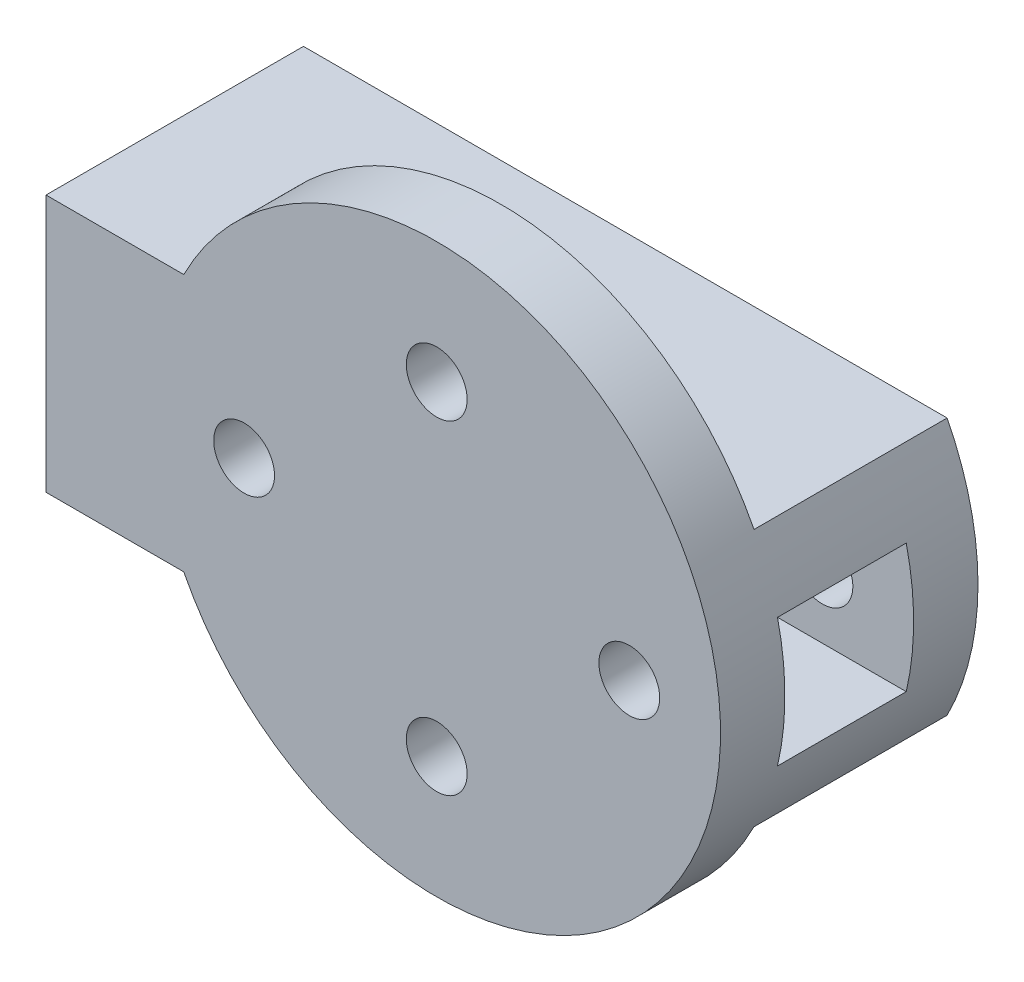
ISO-10303-21;
HEADER;
FILE_DESCRIPTION(('STEP AP214'),'2;1');
FILE_NAME('part.step','',(''),(''),'','','');
FILE_SCHEMA(('AUTOMOTIVE_DESIGN { 1 0 10303 214 1 1 1 1 }'));
ENDSEC;
DATA;
#1=APPLICATION_CONTEXT('core data for automotive mechanical design processes');
#2=APPLICATION_PROTOCOL_DEFINITION('international standard','automotive_design',2000,#1);
#3=PRODUCT_CONTEXT('',#1,'mechanical');
#4=PRODUCT('Part','Part','',(#3));
#5=PRODUCT_RELATED_PRODUCT_CATEGORY('part','',(#4));
#6=PRODUCT_DEFINITION_FORMATION('','',#4);
#7=PRODUCT_DEFINITION_CONTEXT('part definition',#1,'design');
#8=PRODUCT_DEFINITION('design','',#6,#7);
#9=PRODUCT_DEFINITION_SHAPE('','',#8);
#10=(LENGTH_UNIT() NAMED_UNIT(*) SI_UNIT(.MILLI.,.METRE.));
#11=(NAMED_UNIT(*) PLANE_ANGLE_UNIT() SI_UNIT($,.RADIAN.));
#12=(NAMED_UNIT(*) SI_UNIT($,.STERADIAN.) SOLID_ANGLE_UNIT());
#13=UNCERTAINTY_MEASURE_WITH_UNIT(LENGTH_MEASURE(1.E-05),#10,'distance_accuracy_value','');
#14=(GEOMETRIC_REPRESENTATION_CONTEXT(3) GLOBAL_UNCERTAINTY_ASSIGNED_CONTEXT((#13)) GLOBAL_UNIT_ASSIGNED_CONTEXT((#10,
#11,#12)) REPRESENTATION_CONTEXT('',''));
#15=CARTESIAN_POINT('',(0.,0.,0.));
#16=DIRECTION('',(0.,0.,1.));
#17=DIRECTION('',(1.,0.,0.));
#18=AXIS2_PLACEMENT_3D('',#15,#16,#17);
#19=CARTESIAN_POINT('',(0.,0.,3.175));
#20=DIRECTION('',(0.,0.,-1.));
#21=DIRECTION('',(-1.,0.,0.));
#22=AXIS2_PLACEMENT_3D('',#19,#20,#21);
#23=CYLINDRICAL_SURFACE('',#22,14.);
#24=DIRECTION('',(0.,0.,-1.));
#25=VECTOR('',#24,1.);
#26=CARTESIAN_POINT('',(13.6352255206872,3.175,3.175));
#27=LINE('',#26,#25);
#28=CARTESIAN_POINT('',(13.6352255206872,3.175,0.));
#29=VERTEX_POINT('',#28);
#30=CARTESIAN_POINT('',(13.6352255206872,3.175,-6.35));
#31=VERTEX_POINT('',#30);
#32=EDGE_CURVE('E137',#29,#31,#27,.T.);
#33=ORIENTED_EDGE('',*,*,#32,.T.);
#34=CARTESIAN_POINT('',(0.,0.,-6.35));
#35=DIRECTION('',(0.,0.,-1.));
#36=DIRECTION('',(-1.,0.,0.));
#37=AXIS2_PLACEMENT_3D('',#34,#35,#36);
#38=CIRCLE('',#37,14.);
#39=CARTESIAN_POINT('',(13.6352255206872,-3.175,-6.35));
#40=VERTEX_POINT('',#39);
#41=EDGE_CURVE('E117',#31,#40,#38,.T.);
#42=ORIENTED_EDGE('',*,*,#41,.T.);
#43=DIRECTION('',(0.,0.,-1.));
#44=VECTOR('',#43,1.);
#45=CARTESIAN_POINT('',(13.6352255206872,-3.175,3.175));
#46=LINE('',#45,#44);
#47=CARTESIAN_POINT('',(13.6352255206872,-3.175,0.));
#48=VERTEX_POINT('',#47);
#49=EDGE_CURVE('E142',#40,#48,#46,.F.);
#50=ORIENTED_EDGE('',*,*,#49,.T.);
#51=CARTESIAN_POINT('',(0.,0.,0.));
#52=DIRECTION('',(0.,0.,1.));
#53=DIRECTION('',(1.,0.,0.));
#54=AXIS2_PLACEMENT_3D('',#51,#52,#53);
#55=CIRCLE('',#54,14.);
#56=EDGE_CURVE('E145',#48,#29,#55,.T.);
#57=ORIENTED_EDGE('',*,*,#56,.T.);
#58=EDGE_LOOP('',(#33,#42,#50,#57));
#59=FACE_BOUND('',#58,.T.);
#60=DIRECTION('',(0.,0.,-1.));
#61=VECTOR('',#60,1.);
#62=CARTESIAN_POINT('',(-12.477078985083,6.35,3.175));
#63=LINE('',#62,#61);
#64=CARTESIAN_POINT('',(-12.477078985083,6.35,3.175));
#65=VERTEX_POINT('',#64);
#66=CARTESIAN_POINT('',(-12.477078985083,6.35,0.));
#67=VERTEX_POINT('',#66);
#68=EDGE_CURVE('E175',#65,#67,#63,.T.);
#69=ORIENTED_EDGE('',*,*,#68,.F.);
#70=CARTESIAN_POINT('',(0.,0.,3.175));
#71=DIRECTION('',(0.,0.,1.));
#72=DIRECTION('',(1.,0.,0.));
#73=AXIS2_PLACEMENT_3D('',#70,#71,#72);
#74=CIRCLE('',#73,14.);
#75=CARTESIAN_POINT('',(-12.477078985083,-6.35,3.175));
#76=VERTEX_POINT('',#75);
#77=EDGE_CURVE('E182',#76,#65,#74,.T.);
#78=ORIENTED_EDGE('',*,*,#77,.F.);
#79=DIRECTION('',(0.,0.,-1.));
#80=VECTOR('',#79,1.);
#81=CARTESIAN_POINT('',(-12.477078985083,-6.35,3.175));
#82=LINE('',#81,#80);
#83=CARTESIAN_POINT('',(-12.477078985083,-6.35,0.));
#84=VERTEX_POINT('',#83);
#85=EDGE_CURVE('E178',#84,#76,#82,.F.);
#86=ORIENTED_EDGE('',*,*,#85,.F.);
#87=CARTESIAN_POINT('',(0.,0.,0.));
#88=DIRECTION('',(0.,0.,1.));
#89=DIRECTION('',(1.,0.,0.));
#90=AXIS2_PLACEMENT_3D('',#87,#88,#89);
#91=CIRCLE('',#90,14.);
#92=CARTESIAN_POINT('',(12.477078985083,-6.35,0.));
#93=VERTEX_POINT('',#92);
#94=EDGE_CURVE('E181',#84,#93,#91,.T.);
#95=ORIENTED_EDGE('',*,*,#94,.T.);
#96=DIRECTION('',(0.,0.,1.));
#97=VECTOR('',#96,1.);
#98=CARTESIAN_POINT('',(12.477078985083,-6.35,-9.525));
#99=LINE('',#98,#97);
#100=CARTESIAN_POINT('',(12.477078985083,-6.35,-9.525));
#101=VERTEX_POINT('',#100);
#102=EDGE_CURVE('E172',#101,#93,#99,.T.);
#103=ORIENTED_EDGE('',*,*,#102,.F.);
#104=CARTESIAN_POINT('',(0.,0.,-9.525));
#105=DIRECTION('',(0.,0.,-1.));
#106=DIRECTION('',(-1.,0.,0.));
#107=AXIS2_PLACEMENT_3D('',#104,#105,#106);
#108=CIRCLE('',#107,14.);
#109=CARTESIAN_POINT('',(12.477078985083,6.35,-9.525));
#110=VERTEX_POINT('',#109);
#111=EDGE_CURVE('E148',#110,#101,#108,.T.);
#112=ORIENTED_EDGE('',*,*,#111,.F.);
#113=DIRECTION('',(0.,0.,1.));
#114=VECTOR('',#113,1.);
#115=CARTESIAN_POINT('',(12.477078985083,6.35,-9.525));
#116=LINE('',#115,#114);
#117=CARTESIAN_POINT('',(12.477078985083,6.35,0.));
#118=VERTEX_POINT('',#117);
#119=EDGE_CURVE('E158',#110,#118,#116,.T.);
#120=ORIENTED_EDGE('',*,*,#119,.T.);
#121=EDGE_CURVE('E185',#118,#67,#91,.T.);
#122=ORIENTED_EDGE('',*,*,#121,.T.);
#123=EDGE_LOOP('',(#69,#78,#86,#95,#103,#112,#120,#122));
#124=FACE_BOUND('',#123,.T.);
#125=ADVANCED_FACE('F33',(#59,#124),#23,.T.);
#126=CARTESIAN_POINT('',(0.,0.,0.));
#127=DIRECTION('',(0.,0.,1.));
#128=DIRECTION('',(1.,0.,0.));
#129=AXIS2_PLACEMENT_3D('',#126,#127,#128);
#130=PLANE('',#129);
#131=CARTESIAN_POINT('',(0.,-8.,0.));
#132=DIRECTION('',(0.,0.,1.));
#133=DIRECTION('',(1.,0.,0.));
#134=AXIS2_PLACEMENT_3D('',#131,#132,#133);
#135=CIRCLE('',#134,1.5);
#136=CARTESIAN_POINT('',(1.5,-8.,0.));
#137=VERTEX_POINT('',#136);
#138=EDGE_CURVE('E220',#137,#137,#135,.T.);
#139=ORIENTED_EDGE('',*,*,#138,.T.);
#140=EDGE_LOOP('',(#139));
#141=FACE_BOUND('',#140,.T.);
#142=DIRECTION('',(-1.,0.,0.));
#143=VECTOR('',#142,1.);
#144=CARTESIAN_POINT('',(0.,-6.35,0.));
#145=LINE('',#144,#143);
#146=EDGE_CURVE('E11',#93,#84,#145,.T.);
#147=ORIENTED_EDGE('',*,*,#146,.F.);
#148=ORIENTED_EDGE('',*,*,#94,.F.);
#149=EDGE_LOOP('',(#147,#148));
#150=FACE_BOUND('',#149,.T.);
#151=ADVANCED_FACE('F258',(#141,#150),#130,.F.);
#152=CARTESIAN_POINT('',(0.,8.,0.));
#153=DIRECTION('',(0.,0.,1.));
#154=DIRECTION('',(1.,0.,0.));
#155=AXIS2_PLACEMENT_3D('',#152,#153,#154);
#156=CIRCLE('',#155,1.5);
#157=CARTESIAN_POINT('',(1.5,8.,0.));
#158=VERTEX_POINT('',#157);
#159=EDGE_CURVE('E212',#158,#158,#156,.T.);
#160=ORIENTED_EDGE('',*,*,#159,.T.);
#161=EDGE_LOOP('',(#160));
#162=FACE_BOUND('',#161,.T.);
#163=DIRECTION('',(1.,0.,0.));
#164=VECTOR('',#163,1.);
#165=CARTESIAN_POINT('',(0.,6.35,0.));
#166=LINE('',#165,#164);
#167=EDGE_CURVE('E41',#67,#118,#166,.T.);
#168=ORIENTED_EDGE('',*,*,#167,.F.);
#169=ORIENTED_EDGE('',*,*,#121,.F.);
#170=EDGE_LOOP('',(#168,#169));
#171=FACE_BOUND('',#170,.T.);
#172=ADVANCED_FACE('F234',(#162,#171),#130,.F.);
#173=CARTESIAN_POINT('',(0.,0.,3.175));
#174=DIRECTION('',(0.,0.,1.));
#175=DIRECTION('',(1.,0.,0.));
#176=AXIS2_PLACEMENT_3D('',#173,#174,#175);
#177=PLANE('',#176);
#178=CARTESIAN_POINT('',(0.,-8.,3.175));
#179=DIRECTION('',(0.,0.,1.));
#180=DIRECTION('',(-1.,0.,0.));
#181=AXIS2_PLACEMENT_3D('',#178,#179,#180);
#182=CIRCLE('',#181,1.5);
#183=CARTESIAN_POINT('',(-1.5,-8.,3.175));
#184=VERTEX_POINT('',#183);
#185=EDGE_CURVE('E223',#184,#184,#182,.T.);
#186=ORIENTED_EDGE('',*,*,#185,.F.);
#187=EDGE_LOOP('',(#186));
#188=FACE_BOUND('',#187,.T.);
#189=CARTESIAN_POINT('',(0.,8.,3.175));
#190=DIRECTION('',(0.,0.,1.));
#191=DIRECTION('',(1.,0.,0.));
#192=AXIS2_PLACEMENT_3D('',#189,#190,#191);
#193=CIRCLE('',#192,1.5);
#194=CARTESIAN_POINT('',(1.5,8.,3.175));
#195=VERTEX_POINT('',#194);
#196=EDGE_CURVE('E217',#195,#195,#193,.T.);
#197=ORIENTED_EDGE('',*,*,#196,.F.);
#198=EDGE_LOOP('',(#197));
#199=FACE_BOUND('',#198,.T.);
#200=CARTESIAN_POINT('',(9.5,0.,3.175));
#201=DIRECTION('',(0.,0.,1.));
#202=DIRECTION('',(-1.,0.,0.));
#203=AXIS2_PLACEMENT_3D('',#200,#201,#202);
#204=CIRCLE('',#203,1.5);
#205=CARTESIAN_POINT('',(8.,0.,3.175));
#206=VERTEX_POINT('',#205);
#207=EDGE_CURVE('E208',#206,#206,#204,.T.);
#208=ORIENTED_EDGE('',*,*,#207,.F.);
#209=EDGE_LOOP('',(#208));
#210=FACE_BOUND('',#209,.T.);
#211=CARTESIAN_POINT('',(-9.5,0.,3.175));
#212=DIRECTION('',(0.,0.,1.));
#213=DIRECTION('',(1.,0.,0.));
#214=AXIS2_PLACEMENT_3D('',#211,#212,#213);
#215=CIRCLE('',#214,1.5);
#216=CARTESIAN_POINT('',(-8.,0.,3.175));
#217=VERTEX_POINT('',#216);
#218=EDGE_CURVE('E198',#217,#217,#215,.T.);
#219=ORIENTED_EDGE('',*,*,#218,.F.);
#220=EDGE_LOOP('',(#219));
#221=FACE_BOUND('',#220,.T.);
#222=ORIENTED_EDGE('',*,*,#77,.T.);
#223=DIRECTION('',(1.,0.,0.));
#224=VECTOR('',#223,1.);
#225=CARTESIAN_POINT('',(12.477078985083,6.35,3.175));
#226=LINE('',#225,#224);
#227=CARTESIAN_POINT('',(-19.272921014917,6.35,3.175));
#228=VERTEX_POINT('',#227);
#229=EDGE_CURVE('E152',#228,#65,#226,.T.);
#230=ORIENTED_EDGE('',*,*,#229,.F.);
#231=DIRECTION('',(0.,1.,0.));
#232=VECTOR('',#231,1.);
#233=CARTESIAN_POINT('',(-19.272921014917,6.35,3.175));
#234=LINE('',#233,#232);
#235=CARTESIAN_POINT('',(-19.272921014917,-6.35,3.175));
#236=VERTEX_POINT('',#235);
#237=EDGE_CURVE('E160',#236,#228,#234,.T.);
#238=ORIENTED_EDGE('',*,*,#237,.F.);
#239=DIRECTION('',(-1.,0.,0.));
#240=VECTOR('',#239,1.);
#241=CARTESIAN_POINT('',(12.477078985083,-6.35,3.175));
#242=LINE('',#241,#240);
#243=EDGE_CURVE('E147',#76,#236,#242,.T.);
#244=ORIENTED_EDGE('',*,*,#243,.F.);
#245=EDGE_LOOP('',(#222,#230,#238,#244));
#246=FACE_BOUND('',#245,.T.);
#247=ADVANCED_FACE('F230',(#188,#199,#210,#221,#246),#177,.T.);
#248=CARTESIAN_POINT('',(12.477078985083,-6.35,-9.525));
#249=DIRECTION('',(0.,1.,0.));
#250=DIRECTION('',(0.,0.,1.));
#251=AXIS2_PLACEMENT_3D('',#248,#249,#250);
#252=PLANE('',#251);
#253=ORIENTED_EDGE('',*,*,#146,.T.);
#254=ORIENTED_EDGE('',*,*,#85,.T.);
#255=ORIENTED_EDGE('',*,*,#243,.T.);
#256=DIRECTION('',(0.,0.,1.));
#257=VECTOR('',#256,1.);
#258=CARTESIAN_POINT('',(-19.272921014917,-6.35,-9.525));
#259=LINE('',#258,#257);
#260=CARTESIAN_POINT('',(-19.272921014917,-6.35,-9.525));
#261=VERTEX_POINT('',#260);
#262=EDGE_CURVE('E169',#261,#236,#259,.T.);
#263=ORIENTED_EDGE('',*,*,#262,.F.);
#264=DIRECTION('',(-1.,0.,0.));
#265=VECTOR('',#264,1.);
#266=CARTESIAN_POINT('',(12.477078985083,-6.35,-9.525));
#267=LINE('',#266,#265);
#268=EDGE_CURVE('E151',#101,#261,#267,.T.);
#269=ORIENTED_EDGE('',*,*,#268,.F.);
#270=ORIENTED_EDGE('',*,*,#102,.T.);
#271=EDGE_LOOP('',(#253,#254,#255,#263,#269,#270));
#272=FACE_BOUND('',#271,.T.);
#273=ADVANCED_FACE('F233',(#272),#252,.F.);
#274=CARTESIAN_POINT('',(12.477078985083,6.35,-9.525));
#275=DIRECTION('',(0.,-1.,0.));
#276=DIRECTION('',(0.,0.,-1.));
#277=AXIS2_PLACEMENT_3D('',#274,#275,#276);
#278=PLANE('',#277);
#279=ORIENTED_EDGE('',*,*,#229,.T.);
#280=ORIENTED_EDGE('',*,*,#68,.T.);
#281=ORIENTED_EDGE('',*,*,#167,.T.);
#282=ORIENTED_EDGE('',*,*,#119,.F.);
#283=DIRECTION('',(1.,0.,0.));
#284=VECTOR('',#283,1.);
#285=CARTESIAN_POINT('',(12.477078985083,6.35,-9.525));
#286=LINE('',#285,#284);
#287=CARTESIAN_POINT('',(-19.272921014917,6.35,-9.525));
#288=VERTEX_POINT('',#287);
#289=EDGE_CURVE('E156',#288,#110,#286,.T.);
#290=ORIENTED_EDGE('',*,*,#289,.F.);
#291=DIRECTION('',(0.,0.,1.));
#292=VECTOR('',#291,1.);
#293=CARTESIAN_POINT('',(-19.272921014917,6.35,-9.525));
#294=LINE('',#293,#292);
#295=EDGE_CURVE('E166',#288,#228,#294,.T.);
#296=ORIENTED_EDGE('',*,*,#295,.T.);
#297=EDGE_LOOP('',(#279,#280,#281,#282,#290,#296));
#298=FACE_BOUND('',#297,.T.);
#299=ADVANCED_FACE('F247',(#298),#278,.F.);
#300=CARTESIAN_POINT('',(-19.272921014917,6.35,-9.525));
#301=DIRECTION('',(1.,0.,0.));
#302=DIRECTION('',(0.,0.,-1.));
#303=AXIS2_PLACEMENT_3D('',#300,#301,#302);
#304=PLANE('',#303);
#305=DIRECTION('',(0.,0.,-1.));
#306=VECTOR('',#305,1.);
#307=CARTESIAN_POINT('',(-19.272921014917,3.175,-6.35));
#308=LINE('',#307,#306);
#309=CARTESIAN_POINT('',(-19.272921014917,3.175,0.));
#310=VERTEX_POINT('',#309);
#311=CARTESIAN_POINT('',(-19.272921014917,3.175,-6.35));
#312=VERTEX_POINT('',#311);
#313=EDGE_CURVE('E123',#310,#312,#308,.T.);
#314=ORIENTED_EDGE('',*,*,#313,.F.);
#315=DIRECTION('',(0.,1.,0.));
#316=VECTOR('',#315,1.);
#317=CARTESIAN_POINT('',(-19.272921014917,-3.175,0.));
#318=LINE('',#317,#316);
#319=CARTESIAN_POINT('',(-19.272921014917,-3.175,0.));
#320=VERTEX_POINT('',#319);
#321=EDGE_CURVE('E57',#320,#310,#318,.T.);
#322=ORIENTED_EDGE('',*,*,#321,.F.);
#323=DIRECTION('',(0.,0.,1.));
#324=VECTOR('',#323,1.);
#325=CARTESIAN_POINT('',(-19.272921014917,-3.175,-6.35));
#326=LINE('',#325,#324);
#327=CARTESIAN_POINT('',(-19.272921014917,-3.175,-6.35));
#328=VERTEX_POINT('',#327);
#329=EDGE_CURVE('E130',#328,#320,#326,.T.);
#330=ORIENTED_EDGE('',*,*,#329,.F.);
#331=DIRECTION('',(0.,-1.,0.));
#332=VECTOR('',#331,1.);
#333=CARTESIAN_POINT('',(-19.272921014917,-3.175,-6.35));
#334=LINE('',#333,#332);
#335=EDGE_CURVE('E115',#312,#328,#334,.T.);
#336=ORIENTED_EDGE('',*,*,#335,.F.);
#337=EDGE_LOOP('',(#314,#322,#330,#336));
#338=FACE_BOUND('',#337,.T.);
#339=ORIENTED_EDGE('',*,*,#237,.T.);
#340=ORIENTED_EDGE('',*,*,#295,.F.);
#341=DIRECTION('',(0.,1.,0.));
#342=VECTOR('',#341,1.);
#343=CARTESIAN_POINT('',(-19.272921014917,6.35,-9.525));
#344=LINE('',#343,#342);
#345=EDGE_CURVE('E154',#261,#288,#344,.T.);
#346=ORIENTED_EDGE('',*,*,#345,.F.);
#347=ORIENTED_EDGE('',*,*,#262,.T.);
#348=EDGE_LOOP('',(#339,#340,#346,#347));
#349=FACE_BOUND('',#348,.T.);
#350=ADVANCED_FACE('F127',(#338,#349),#304,.F.);
#351=CARTESIAN_POINT('',(0.,0.,-9.525));
#352=DIRECTION('',(0.,0.,-1.));
#353=DIRECTION('',(-1.,0.,0.));
#354=AXIS2_PLACEMENT_3D('',#351,#352,#353);
#355=PLANE('',#354);
#356=CARTESIAN_POINT('',(9.5,0.,-9.525));
#357=DIRECTION('',(0.,0.,1.));
#358=DIRECTION('',(-1.,0.,0.));
#359=AXIS2_PLACEMENT_3D('',#356,#357,#358);
#360=CIRCLE('',#359,1.5);
#361=CARTESIAN_POINT('',(8.,0.,-9.525));
#362=VERTEX_POINT('',#361);
#363=EDGE_CURVE('E211',#362,#362,#360,.T.);
#364=ORIENTED_EDGE('',*,*,#363,.T.);
#365=EDGE_LOOP('',(#364));
#366=FACE_BOUND('',#365,.T.);
#367=CARTESIAN_POINT('',(-9.5,0.,-9.525));
#368=DIRECTION('',(0.,0.,1.));
#369=DIRECTION('',(1.,0.,0.));
#370=AXIS2_PLACEMENT_3D('',#367,#368,#369);
#371=CIRCLE('',#370,1.5);
#372=CARTESIAN_POINT('',(-8.,0.,-9.525));
#373=VERTEX_POINT('',#372);
#374=EDGE_CURVE('E192',#373,#373,#371,.T.);
#375=ORIENTED_EDGE('',*,*,#374,.T.);
#376=EDGE_LOOP('',(#375));
#377=FACE_BOUND('',#376,.T.);
#378=ORIENTED_EDGE('',*,*,#111,.T.);
#379=ORIENTED_EDGE('',*,*,#268,.T.);
#380=ORIENTED_EDGE('',*,*,#345,.T.);
#381=ORIENTED_EDGE('',*,*,#289,.T.);
#382=EDGE_LOOP('',(#378,#379,#380,#381));
#383=FACE_BOUND('',#382,.T.);
#384=ADVANCED_FACE('F272',(#366,#377,#383),#355,.T.);
#385=CARTESIAN_POINT('',(14.,-3.175,0.));
#386=DIRECTION('',(0.,0.,1.));
#387=DIRECTION('',(1.,0.,0.));
#388=AXIS2_PLACEMENT_3D('',#385,#386,#387);
#389=PLANE('',#388);
#390=CARTESIAN_POINT('',(9.5,0.,0.));
#391=DIRECTION('',(0.,0.,1.));
#392=DIRECTION('',(1.,0.,0.));
#393=AXIS2_PLACEMENT_3D('',#390,#391,#392);
#394=CIRCLE('',#393,1.5);
#395=CARTESIAN_POINT('',(11.,0.,0.));
#396=VERTEX_POINT('',#395);
#397=EDGE_CURVE('E203',#396,#396,#394,.T.);
#398=ORIENTED_EDGE('',*,*,#397,.T.);
#399=EDGE_LOOP('',(#398));
#400=FACE_BOUND('',#399,.T.);
#401=CARTESIAN_POINT('',(-9.5,0.,0.));
#402=DIRECTION('',(0.,0.,1.));
#403=DIRECTION('',(1.,0.,0.));
#404=AXIS2_PLACEMENT_3D('',#401,#402,#403);
#405=CIRCLE('',#404,1.5);
#406=CARTESIAN_POINT('',(-8.,0.,0.));
#407=VERTEX_POINT('',#406);
#408=EDGE_CURVE('E191',#407,#407,#405,.T.);
#409=ORIENTED_EDGE('',*,*,#408,.T.);
#410=EDGE_LOOP('',(#409));
#411=FACE_BOUND('',#410,.T.);
#412=ORIENTED_EDGE('',*,*,#56,.F.);
#413=DIRECTION('',(-1.,0.,0.));
#414=VECTOR('',#413,1.);
#415=CARTESIAN_POINT('',(14.,-3.175,0.));
#416=LINE('',#415,#414);
#417=EDGE_CURVE('E135',#48,#320,#416,.T.);
#418=ORIENTED_EDGE('',*,*,#417,.T.);
#419=ORIENTED_EDGE('',*,*,#321,.T.);
#420=DIRECTION('',(-1.,0.,0.));
#421=VECTOR('',#420,1.);
#422=CARTESIAN_POINT('',(14.,3.175,0.));
#423=LINE('',#422,#421);
#424=EDGE_CURVE('E120',#29,#310,#423,.T.);
#425=ORIENTED_EDGE('',*,*,#424,.F.);
#426=EDGE_LOOP('',(#412,#418,#419,#425));
#427=FACE_BOUND('',#426,.T.);
#428=ADVANCED_FACE('F277',(#400,#411,#427),#389,.F.);
#429=CARTESIAN_POINT('',(14.,-3.175,-6.35));
#430=DIRECTION('',(0.,-1.,0.));
#431=DIRECTION('',(0.,0.,-1.));
#432=AXIS2_PLACEMENT_3D('',#429,#430,#431);
#433=PLANE('',#432);
#434=DIRECTION('',(-1.,0.,0.));
#435=VECTOR('',#434,1.);
#436=CARTESIAN_POINT('',(14.,-3.175,-6.35));
#437=LINE('',#436,#435);
#438=EDGE_CURVE('E119',#40,#328,#437,.T.);
#439=ORIENTED_EDGE('',*,*,#438,.T.);
#440=ORIENTED_EDGE('',*,*,#329,.T.);
#441=ORIENTED_EDGE('',*,*,#417,.F.);
#442=ORIENTED_EDGE('',*,*,#49,.F.);
#443=EDGE_LOOP('',(#439,#440,#441,#442));
#444=FACE_BOUND('',#443,.T.);
#445=ADVANCED_FACE('F281',(#444),#433,.F.);
#446=CARTESIAN_POINT('',(14.,-3.175,-6.35));
#447=DIRECTION('',(0.,0.,-1.));
#448=DIRECTION('',(-1.,0.,0.));
#449=AXIS2_PLACEMENT_3D('',#446,#447,#448);
#450=PLANE('',#449);
#451=CARTESIAN_POINT('',(9.5,0.,-6.35));
#452=DIRECTION('',(0.,0.,-1.));
#453=DIRECTION('',(-1.,0.,0.));
#454=AXIS2_PLACEMENT_3D('',#451,#452,#453);
#455=CIRCLE('',#454,1.5);
#456=CARTESIAN_POINT('',(8.,0.,-6.35));
#457=VERTEX_POINT('',#456);
#458=EDGE_CURVE('E36',#457,#457,#455,.T.);
#459=ORIENTED_EDGE('',*,*,#458,.T.);
#460=EDGE_LOOP('',(#459));
#461=FACE_BOUND('',#460,.T.);
#462=CARTESIAN_POINT('',(-9.5,0.,-6.35));
#463=DIRECTION('',(0.,0.,-1.));
#464=DIRECTION('',(-1.,0.,0.));
#465=AXIS2_PLACEMENT_3D('',#462,#463,#464);
#466=CIRCLE('',#465,1.5);
#467=CARTESIAN_POINT('',(-11.,0.,-6.35));
#468=VERTEX_POINT('',#467);
#469=EDGE_CURVE('E189',#468,#468,#466,.T.);
#470=ORIENTED_EDGE('',*,*,#469,.T.);
#471=EDGE_LOOP('',(#470));
#472=FACE_BOUND('',#471,.T.);
#473=DIRECTION('',(-1.,0.,0.));
#474=VECTOR('',#473,1.);
#475=CARTESIAN_POINT('',(14.,3.175,-6.35));
#476=LINE('',#475,#474);
#477=EDGE_CURVE('E49',#31,#312,#476,.T.);
#478=ORIENTED_EDGE('',*,*,#477,.T.);
#479=ORIENTED_EDGE('',*,*,#335,.T.);
#480=ORIENTED_EDGE('',*,*,#438,.F.);
#481=ORIENTED_EDGE('',*,*,#41,.F.);
#482=EDGE_LOOP('',(#478,#479,#480,#481));
#483=FACE_BOUND('',#482,.T.);
#484=ADVANCED_FACE('F112',(#461,#472,#483),#450,.F.);
#485=CARTESIAN_POINT('',(14.,3.175,-6.35));
#486=DIRECTION('',(0.,1.,0.));
#487=DIRECTION('',(0.,0.,1.));
#488=AXIS2_PLACEMENT_3D('',#485,#486,#487);
#489=PLANE('',#488);
#490=ORIENTED_EDGE('',*,*,#424,.T.);
#491=ORIENTED_EDGE('',*,*,#313,.T.);
#492=ORIENTED_EDGE('',*,*,#477,.F.);
#493=ORIENTED_EDGE('',*,*,#32,.F.);
#494=EDGE_LOOP('',(#490,#491,#492,#493));
#495=FACE_BOUND('',#494,.T.);
#496=ADVANCED_FACE('F124',(#495),#489,.F.);
#497=CARTESIAN_POINT('',(-9.5,0.,-9.525));
#498=DIRECTION('',(0.,0.,1.));
#499=DIRECTION('',(1.,0.,0.));
#500=AXIS2_PLACEMENT_3D('',#497,#498,#499);
#501=CYLINDRICAL_SURFACE('',#500,1.5);
#502=ORIENTED_EDGE('',*,*,#374,.F.);
#503=EDGE_LOOP('',(#502));
#504=FACE_BOUND('',#503,.T.);
#505=ORIENTED_EDGE('',*,*,#469,.F.);
#506=EDGE_LOOP('',(#505));
#507=FACE_BOUND('',#506,.T.);
#508=ADVANCED_FACE('F285',(#504,#507),#501,.F.);
#509=ORIENTED_EDGE('',*,*,#218,.T.);
#510=EDGE_LOOP('',(#509));
#511=FACE_BOUND('',#510,.T.);
#512=ORIENTED_EDGE('',*,*,#408,.F.);
#513=EDGE_LOOP('',(#512));
#514=FACE_BOUND('',#513,.T.);
#515=ADVANCED_FACE('F292',(#511,#514),#501,.F.);
#516=CARTESIAN_POINT('',(9.5,0.,-9.525));
#517=DIRECTION('',(0.,0.,1.));
#518=DIRECTION('',(1.,0.,0.));
#519=AXIS2_PLACEMENT_3D('',#516,#517,#518);
#520=CYLINDRICAL_SURFACE('',#519,1.5);
#521=ORIENTED_EDGE('',*,*,#363,.F.);
#522=EDGE_LOOP('',(#521));
#523=FACE_BOUND('',#522,.T.);
#524=ORIENTED_EDGE('',*,*,#458,.F.);
#525=EDGE_LOOP('',(#524));
#526=FACE_BOUND('',#525,.T.);
#527=ADVANCED_FACE('F295',(#523,#526),#520,.F.);
#528=ORIENTED_EDGE('',*,*,#207,.T.);
#529=EDGE_LOOP('',(#528));
#530=FACE_BOUND('',#529,.T.);
#531=ORIENTED_EDGE('',*,*,#397,.F.);
#532=EDGE_LOOP('',(#531));
#533=FACE_BOUND('',#532,.T.);
#534=ADVANCED_FACE('F297',(#530,#533),#520,.F.);
#535=CARTESIAN_POINT('',(0.,8.,-9.525));
#536=DIRECTION('',(0.,0.,1.));
#537=DIRECTION('',(1.,0.,0.));
#538=AXIS2_PLACEMENT_3D('',#535,#536,#537);
#539=CYLINDRICAL_SURFACE('',#538,1.5);
#540=ORIENTED_EDGE('',*,*,#196,.T.);
#541=EDGE_LOOP('',(#540));
#542=FACE_BOUND('',#541,.T.);
#543=ORIENTED_EDGE('',*,*,#159,.F.);
#544=EDGE_LOOP('',(#543));
#545=FACE_BOUND('',#544,.T.);
#546=ADVANCED_FACE('F300',(#542,#545),#539,.F.);
#547=CARTESIAN_POINT('',(0.,-8.,-9.525));
#548=DIRECTION('',(0.,0.,1.));
#549=DIRECTION('',(1.,0.,0.));
#550=AXIS2_PLACEMENT_3D('',#547,#548,#549);
#551=CYLINDRICAL_SURFACE('',#550,1.5);
#552=ORIENTED_EDGE('',*,*,#185,.T.);
#553=EDGE_LOOP('',(#552));
#554=FACE_BOUND('',#553,.T.);
#555=ORIENTED_EDGE('',*,*,#138,.F.);
#556=EDGE_LOOP('',(#555));
#557=FACE_BOUND('',#556,.T.);
#558=ADVANCED_FACE('F227',(#554,#557),#551,.F.);
#559=CLOSED_SHELL('',(#125,#151,#172,#247,#273,#299,#350,#384,#428,#445,#484,#496,#508,#515,
#527,#534,#546,#558));
#560=MANIFOLD_SOLID_BREP('B2',#559);
#561=ADVANCED_BREP_SHAPE_REPRESENTATION('',(#18,#560),#14);
#562=SHAPE_DEFINITION_REPRESENTATION(#9,#561);
ENDSEC;
END-ISO-10303-21;
